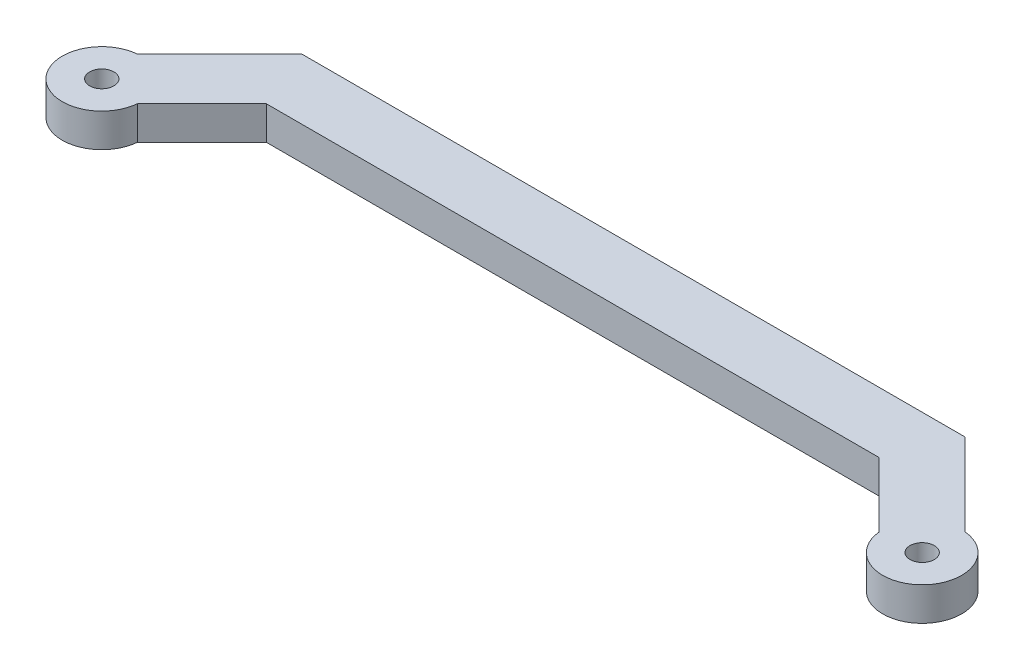
ISO-10303-21;
HEADER;
FILE_DESCRIPTION(('STEP AP214'),'2;1');
FILE_NAME('part.step','',(''),(''),'','','');
FILE_SCHEMA(('AUTOMOTIVE_DESIGN { 1 0 10303 214 1 1 1 1 }'));
ENDSEC;
DATA;
#1=APPLICATION_CONTEXT('core data for automotive mechanical design processes');
#2=APPLICATION_PROTOCOL_DEFINITION('international standard','automotive_design',2000,#1);
#3=PRODUCT_CONTEXT('',#1,'mechanical');
#4=PRODUCT('Part','Part','',(#3));
#5=PRODUCT_RELATED_PRODUCT_CATEGORY('part','',(#4));
#6=PRODUCT_DEFINITION_FORMATION('','',#4);
#7=PRODUCT_DEFINITION_CONTEXT('part definition',#1,'design');
#8=PRODUCT_DEFINITION('design','',#6,#7);
#9=PRODUCT_DEFINITION_SHAPE('','',#8);
#10=(LENGTH_UNIT() NAMED_UNIT(*) SI_UNIT(.MILLI.,.METRE.));
#11=(NAMED_UNIT(*) PLANE_ANGLE_UNIT() SI_UNIT($,.RADIAN.));
#12=(NAMED_UNIT(*) SI_UNIT($,.STERADIAN.) SOLID_ANGLE_UNIT());
#13=UNCERTAINTY_MEASURE_WITH_UNIT(LENGTH_MEASURE(1.E-05),#10,'distance_accuracy_value','');
#14=(GEOMETRIC_REPRESENTATION_CONTEXT(3) GLOBAL_UNCERTAINTY_ASSIGNED_CONTEXT((#13)) GLOBAL_UNIT_ASSIGNED_CONTEXT((#10,
#11,#12)) REPRESENTATION_CONTEXT('',''));
#15=CARTESIAN_POINT('',(0.,0.,0.));
#16=DIRECTION('',(0.,0.,1.));
#17=DIRECTION('',(1.,0.,0.));
#18=AXIS2_PLACEMENT_3D('',#15,#16,#17);
#19=CARTESIAN_POINT('',(-67.5,5.5,10.));
#20=DIRECTION('',(0.,-1.,0.));
#21=DIRECTION('',(0.,0.,-1.));
#22=AXIS2_PLACEMENT_3D('',#19,#20,#21);
#23=PLANE('',#22);
#24=CARTESIAN_POINT('',(-67.5,5.5,10.));
#25=DIRECTION('',(0.,-1.,0.));
#26=DIRECTION('',(0.,0.,-1.));
#27=AXIS2_PLACEMENT_3D('',#24,#25,#26);
#28=CIRCLE('',#27,2.);
#29=CARTESIAN_POINT('',(-67.5,5.5,8.00000000000001));
#30=VERTEX_POINT('',#29);
#31=EDGE_CURVE('E191',#30,#30,#28,.T.);
#32=ORIENTED_EDGE('',*,*,#31,.T.);
#33=EDGE_LOOP('',(#32));
#34=FACE_BOUND('',#33,.T.);
#35=DIRECTION('',(-0.707106781186546,0.,0.707106781186549));
#36=VECTOR('',#35,1.);
#37=CARTESIAN_POINT('',(-50.4289321881346,5.5,0.));
#38=LINE('',#37,#36);
#39=CARTESIAN_POINT('',(-50.4289321881346,5.5,0.));
#40=VERTEX_POINT('',#39);
#41=CARTESIAN_POINT('',(-61.0276310629496,5.5,10.598698874815));
#42=VERTEX_POINT('',#41);
#43=EDGE_CURVE('E205',#40,#42,#38,.T.);
#44=ORIENTED_EDGE('',*,*,#43,.F.);
#45=DIRECTION('',(1.,0.,0.));
#46=VECTOR('',#45,1.);
#47=CARTESIAN_POINT('',(-50.4289321881346,5.5,0.));
#48=LINE('',#47,#46);
#49=CARTESIAN_POINT('',(50.4289321881346,5.5,0.));
#50=VERTEX_POINT('',#49);
#51=EDGE_CURVE('E165',#40,#50,#48,.T.);
#52=ORIENTED_EDGE('',*,*,#51,.T.);
#53=DIRECTION('',(0.707106781186546,0.,0.707106781186549));
#54=VECTOR('',#53,1.);
#55=CARTESIAN_POINT('',(50.4289321881346,5.5,0.));
#56=LINE('',#55,#54);
#57=CARTESIAN_POINT('',(61.0276310629496,5.5,10.598698874815));
#58=VERTEX_POINT('',#57);
#59=EDGE_CURVE('E157',#50,#58,#56,.T.);
#60=ORIENTED_EDGE('',*,*,#59,.T.);
#61=CARTESIAN_POINT('',(67.5,5.5,9.99999999999999));
#62=DIRECTION('',(0.,1.,0.));
#63=DIRECTION('',(0.,0.,1.));
#64=AXIS2_PLACEMENT_3D('',#61,#62,#63);
#65=CIRCLE('',#64,6.5);
#66=CARTESIAN_POINT('',(68.0986988748151,5.5,3.52763106294956));
#67=VERTEX_POINT('',#66);
#68=EDGE_CURVE('E163',#58,#67,#65,.T.);
#69=ORIENTED_EDGE('',*,*,#68,.T.);
#70=DIRECTION('',(0.707106781186546,0.,0.707106781186549));
#71=VECTOR('',#70,1.);
#72=CARTESIAN_POINT('',(54.5710678118655,5.5,-10.));
#73=LINE('',#72,#71);
#74=CARTESIAN_POINT('',(54.5710678118655,5.5,-10.));
#75=VERTEX_POINT('',#74);
#76=EDGE_CURVE('E180',#75,#67,#73,.T.);
#77=ORIENTED_EDGE('',*,*,#76,.F.);
#78=DIRECTION('',(-1.,0.,0.));
#79=VECTOR('',#78,1.);
#80=CARTESIAN_POINT('',(54.5710678118655,5.5,-10.));
#81=LINE('',#80,#79);
#82=CARTESIAN_POINT('',(-54.5710678118655,5.5,-9.99999999999999));
#83=VERTEX_POINT('',#82);
#84=EDGE_CURVE('E182',#75,#83,#81,.T.);
#85=ORIENTED_EDGE('',*,*,#84,.T.);
#86=DIRECTION('',(-0.707106781186546,0.,0.707106781186549));
#87=VECTOR('',#86,1.);
#88=CARTESIAN_POINT('',(-54.5710678118655,5.5,-9.99999999999999));
#89=LINE('',#88,#87);
#90=CARTESIAN_POINT('',(-68.0986988748151,5.5,3.52763106294959));
#91=VERTEX_POINT('',#90);
#92=EDGE_CURVE('E227',#83,#91,#89,.T.);
#93=ORIENTED_EDGE('',*,*,#92,.T.);
#94=CARTESIAN_POINT('',(-67.5,5.5,10.));
#95=DIRECTION('',(0.,-1.,0.));
#96=DIRECTION('',(0.,0.,-1.));
#97=AXIS2_PLACEMENT_3D('',#94,#95,#96);
#98=CIRCLE('',#97,6.5);
#99=EDGE_CURVE('E232',#42,#91,#98,.T.);
#100=ORIENTED_EDGE('',*,*,#99,.F.);
#101=EDGE_LOOP('',(#44,#52,#60,#69,#77,#85,#93,#100));
#102=FACE_BOUND('',#101,.T.);
#103=CARTESIAN_POINT('',(67.5,5.5,9.99999999999999));
#104=DIRECTION('',(0.,1.,0.));
#105=DIRECTION('',(0.,0.,1.));
#106=AXIS2_PLACEMENT_3D('',#103,#104,#105);
#107=CIRCLE('',#106,2.);
#108=CARTESIAN_POINT('',(67.5,5.5,12.));
#109=VERTEX_POINT('',#108);
#110=EDGE_CURVE('E240',#109,#109,#107,.T.);
#111=ORIENTED_EDGE('',*,*,#110,.F.);
#112=EDGE_LOOP('',(#111));
#113=FACE_BOUND('',#112,.T.);
#114=ADVANCED_FACE('F87',(#34,#102,#113),#23,.F.);
#115=CARTESIAN_POINT('',(-67.5,0.,10.));
#116=DIRECTION('',(0.,-1.,0.));
#117=DIRECTION('',(0.,0.,-1.));
#118=AXIS2_PLACEMENT_3D('',#115,#116,#117);
#119=PLANE('',#118);
#120=DIRECTION('',(-0.707106781186546,0.,0.707106781186549));
#121=VECTOR('',#120,1.);
#122=CARTESIAN_POINT('',(-50.4289321881346,0.,0.));
#123=LINE('',#122,#121);
#124=CARTESIAN_POINT('',(-50.4289321881346,0.,0.));
#125=VERTEX_POINT('',#124);
#126=CARTESIAN_POINT('',(-61.0276310629496,0.,10.598698874815));
#127=VERTEX_POINT('',#126);
#128=EDGE_CURVE('E187',#125,#127,#123,.T.);
#129=ORIENTED_EDGE('',*,*,#128,.T.);
#130=CARTESIAN_POINT('',(-67.5,0.,10.));
#131=DIRECTION('',(0.,-1.,0.));
#132=DIRECTION('',(0.,0.,-1.));
#133=AXIS2_PLACEMENT_3D('',#130,#131,#132);
#134=CIRCLE('',#133,6.5);
#135=CARTESIAN_POINT('',(-68.0986988748151,0.,3.52763106294959));
#136=VERTEX_POINT('',#135);
#137=EDGE_CURVE('E190',#127,#136,#134,.T.);
#138=ORIENTED_EDGE('',*,*,#137,.T.);
#139=DIRECTION('',(-0.707106781186546,0.,0.707106781186549));
#140=VECTOR('',#139,1.);
#141=CARTESIAN_POINT('',(-54.5710678118655,0.,-9.99999999999999));
#142=LINE('',#141,#140);
#143=CARTESIAN_POINT('',(-54.5710678118655,0.,-9.99999999999999));
#144=VERTEX_POINT('',#143);
#145=EDGE_CURVE('E194',#144,#136,#142,.T.);
#146=ORIENTED_EDGE('',*,*,#145,.F.);
#147=DIRECTION('',(-1.,0.,0.));
#148=VECTOR('',#147,1.);
#149=CARTESIAN_POINT('',(54.5710678118655,0.,-10.));
#150=LINE('',#149,#148);
#151=CARTESIAN_POINT('',(54.5710678118655,0.,-10.));
#152=VERTEX_POINT('',#151);
#153=EDGE_CURVE('E197',#152,#144,#150,.T.);
#154=ORIENTED_EDGE('',*,*,#153,.F.);
#155=DIRECTION('',(0.707106781186546,0.,0.707106781186549));
#156=VECTOR('',#155,1.);
#157=CARTESIAN_POINT('',(54.5710678118655,0.,-10.));
#158=LINE('',#157,#156);
#159=CARTESIAN_POINT('',(68.0986988748151,0.,3.52763106294956));
#160=VERTEX_POINT('',#159);
#161=EDGE_CURVE('E199',#152,#160,#158,.T.);
#162=ORIENTED_EDGE('',*,*,#161,.T.);
#163=CARTESIAN_POINT('',(67.5,0.,9.99999999999999));
#164=DIRECTION('',(0.,1.,0.));
#165=DIRECTION('',(0.,0.,1.));
#166=AXIS2_PLACEMENT_3D('',#163,#164,#165);
#167=CIRCLE('',#166,6.5);
#168=CARTESIAN_POINT('',(61.0276310629496,0.,10.598698874815));
#169=VERTEX_POINT('',#168);
#170=EDGE_CURVE('E202',#169,#160,#167,.T.);
#171=ORIENTED_EDGE('',*,*,#170,.F.);
#172=DIRECTION('',(0.707106781186546,0.,0.707106781186549));
#173=VECTOR('',#172,1.);
#174=CARTESIAN_POINT('',(50.4289321881346,0.,0.));
#175=LINE('',#174,#173);
#176=CARTESIAN_POINT('',(50.4289321881346,0.,0.));
#177=VERTEX_POINT('',#176);
#178=EDGE_CURVE('E172',#177,#169,#175,.T.);
#179=ORIENTED_EDGE('',*,*,#178,.F.);
#180=DIRECTION('',(1.,0.,0.));
#181=VECTOR('',#180,1.);
#182=CARTESIAN_POINT('',(-50.4289321881346,0.,0.));
#183=LINE('',#182,#181);
#184=EDGE_CURVE('E133',#125,#177,#183,.T.);
#185=ORIENTED_EDGE('',*,*,#184,.F.);
#186=EDGE_LOOP('',(#129,#138,#146,#154,#162,#171,#179,#185));
#187=FACE_BOUND('',#186,.T.);
#188=CARTESIAN_POINT('',(-67.5,0.,10.));
#189=DIRECTION('',(0.,-1.,0.));
#190=DIRECTION('',(0.,0.,-1.));
#191=AXIS2_PLACEMENT_3D('',#188,#189,#190);
#192=CIRCLE('',#191,2.);
#193=CARTESIAN_POINT('',(-67.5,0.,8.00000000000001));
#194=VERTEX_POINT('',#193);
#195=EDGE_CURVE('E237',#194,#194,#192,.T.);
#196=ORIENTED_EDGE('',*,*,#195,.F.);
#197=EDGE_LOOP('',(#196));
#198=FACE_BOUND('',#197,.T.);
#199=CARTESIAN_POINT('',(67.5,0.,9.99999999999999));
#200=DIRECTION('',(0.,1.,0.));
#201=DIRECTION('',(0.,0.,1.));
#202=AXIS2_PLACEMENT_3D('',#199,#200,#201);
#203=CIRCLE('',#202,2.);
#204=CARTESIAN_POINT('',(67.5,0.,12.));
#205=VERTEX_POINT('',#204);
#206=EDGE_CURVE('E243',#205,#205,#203,.T.);
#207=ORIENTED_EDGE('',*,*,#206,.T.);
#208=EDGE_LOOP('',(#207));
#209=FACE_BOUND('',#208,.T.);
#210=ADVANCED_FACE('F218',(#187,#198,#209),#119,.T.);
#211=CARTESIAN_POINT('',(-50.4289321881346,5.5,0.));
#212=DIRECTION('',(0.707106781186549,0.,0.707106781186546));
#213=DIRECTION('',(0.707106781186546,0.,-0.707106781186549));
#214=AXIS2_PLACEMENT_3D('',#211,#212,#213);
#215=PLANE('',#214);
#216=ORIENTED_EDGE('',*,*,#128,.F.);
#217=DIRECTION('',(0.,-1.,0.));
#218=VECTOR('',#217,1.);
#219=CARTESIAN_POINT('',(-50.4289321881346,5.5,0.));
#220=LINE('',#219,#218);
#221=EDGE_CURVE('E12',#40,#125,#220,.T.);
#222=ORIENTED_EDGE('',*,*,#221,.F.);
#223=ORIENTED_EDGE('',*,*,#43,.T.);
#224=DIRECTION('',(0.,-1.,0.));
#225=VECTOR('',#224,1.);
#226=CARTESIAN_POINT('',(-61.0276310629496,5.5,10.598698874815));
#227=LINE('',#226,#225);
#228=EDGE_CURVE('E91',#42,#127,#227,.T.);
#229=ORIENTED_EDGE('',*,*,#228,.T.);
#230=EDGE_LOOP('',(#216,#222,#223,#229));
#231=FACE_BOUND('',#230,.T.);
#232=ADVANCED_FACE('F89',(#231),#215,.T.);
#233=CARTESIAN_POINT('',(-50.4289321881346,5.5,0.));
#234=DIRECTION('',(0.,0.,-1.));
#235=DIRECTION('',(-1.,0.,0.));
#236=AXIS2_PLACEMENT_3D('',#233,#234,#235);
#237=PLANE('',#236);
#238=ORIENTED_EDGE('',*,*,#184,.T.);
#239=DIRECTION('',(0.,-1.,0.));
#240=VECTOR('',#239,1.);
#241=CARTESIAN_POINT('',(50.4289321881346,5.5,0.));
#242=LINE('',#241,#240);
#243=EDGE_CURVE('E97',#50,#177,#242,.T.);
#244=ORIENTED_EDGE('',*,*,#243,.F.);
#245=ORIENTED_EDGE('',*,*,#51,.F.);
#246=ORIENTED_EDGE('',*,*,#221,.T.);
#247=EDGE_LOOP('',(#238,#244,#245,#246));
#248=FACE_BOUND('',#247,.T.);
#249=ADVANCED_FACE('F262',(#248),#237,.F.);
#250=CARTESIAN_POINT('',(50.4289321881346,5.5,0.));
#251=DIRECTION('',(0.707106781186549,0.,-0.707106781186546));
#252=DIRECTION('',(-0.707106781186546,0.,-0.707106781186549));
#253=AXIS2_PLACEMENT_3D('',#250,#251,#252);
#254=PLANE('',#253);
#255=ORIENTED_EDGE('',*,*,#178,.T.);
#256=DIRECTION('',(0.,-1.,0.));
#257=VECTOR('',#256,1.);
#258=CARTESIAN_POINT('',(61.0276310629496,5.5,10.598698874815));
#259=LINE('',#258,#257);
#260=EDGE_CURVE('E169',#58,#169,#259,.T.);
#261=ORIENTED_EDGE('',*,*,#260,.F.);
#262=ORIENTED_EDGE('',*,*,#59,.F.);
#263=ORIENTED_EDGE('',*,*,#243,.T.);
#264=EDGE_LOOP('',(#255,#261,#262,#263));
#265=FACE_BOUND('',#264,.T.);
#266=ADVANCED_FACE('F170',(#265),#254,.F.);
#267=CARTESIAN_POINT('',(67.5,5.5,9.99999999999999));
#268=DIRECTION('',(0.,-1.,0.));
#269=DIRECTION('',(0.,0.,-1.));
#270=AXIS2_PLACEMENT_3D('',#267,#268,#269);
#271=CYLINDRICAL_SURFACE('',#270,6.5);
#272=ORIENTED_EDGE('',*,*,#170,.T.);
#273=DIRECTION('',(0.,-1.,0.));
#274=VECTOR('',#273,1.);
#275=CARTESIAN_POINT('',(68.0986988748151,5.5,3.52763106294956));
#276=LINE('',#275,#274);
#277=EDGE_CURVE('E176',#67,#160,#276,.T.);
#278=ORIENTED_EDGE('',*,*,#277,.F.);
#279=ORIENTED_EDGE('',*,*,#68,.F.);
#280=ORIENTED_EDGE('',*,*,#260,.T.);
#281=EDGE_LOOP('',(#272,#278,#279,#280));
#282=FACE_BOUND('',#281,.T.);
#283=ADVANCED_FACE('F178',(#282),#271,.T.);
#284=CARTESIAN_POINT('',(54.5710678118655,5.5,-10.));
#285=DIRECTION('',(0.707106781186549,0.,-0.707106781186546));
#286=DIRECTION('',(-0.707106781186546,0.,-0.707106781186549));
#287=AXIS2_PLACEMENT_3D('',#284,#285,#286);
#288=PLANE('',#287);
#289=ORIENTED_EDGE('',*,*,#161,.F.);
#290=DIRECTION('',(0.,-1.,0.));
#291=VECTOR('',#290,1.);
#292=CARTESIAN_POINT('',(54.5710678118655,5.5,-10.));
#293=LINE('',#292,#291);
#294=EDGE_CURVE('E209',#75,#152,#293,.T.);
#295=ORIENTED_EDGE('',*,*,#294,.F.);
#296=ORIENTED_EDGE('',*,*,#76,.T.);
#297=ORIENTED_EDGE('',*,*,#277,.T.);
#298=EDGE_LOOP('',(#289,#295,#296,#297));
#299=FACE_BOUND('',#298,.T.);
#300=ADVANCED_FACE('F223',(#299),#288,.T.);
#301=CARTESIAN_POINT('',(54.5710678118655,5.5,-10.));
#302=DIRECTION('',(0.,0.,1.));
#303=DIRECTION('',(1.,0.,0.));
#304=AXIS2_PLACEMENT_3D('',#301,#302,#303);
#305=PLANE('',#304);
#306=ORIENTED_EDGE('',*,*,#153,.T.);
#307=DIRECTION('',(0.,-1.,0.));
#308=VECTOR('',#307,1.);
#309=CARTESIAN_POINT('',(-54.5710678118655,5.5,-9.99999999999999));
#310=LINE('',#309,#308);
#311=EDGE_CURVE('E211',#83,#144,#310,.T.);
#312=ORIENTED_EDGE('',*,*,#311,.F.);
#313=ORIENTED_EDGE('',*,*,#84,.F.);
#314=ORIENTED_EDGE('',*,*,#294,.T.);
#315=EDGE_LOOP('',(#306,#312,#313,#314));
#316=FACE_BOUND('',#315,.T.);
#317=ADVANCED_FACE('F229',(#316),#305,.F.);
#318=CARTESIAN_POINT('',(-54.5710678118655,5.5,-9.99999999999999));
#319=DIRECTION('',(0.707106781186549,0.,0.707106781186546));
#320=DIRECTION('',(0.707106781186546,0.,-0.707106781186549));
#321=AXIS2_PLACEMENT_3D('',#318,#319,#320);
#322=PLANE('',#321);
#323=ORIENTED_EDGE('',*,*,#145,.T.);
#324=DIRECTION('',(0.,-1.,0.));
#325=VECTOR('',#324,1.);
#326=CARTESIAN_POINT('',(-68.0986988748151,5.5,3.52763106294959));
#327=LINE('',#326,#325);
#328=EDGE_CURVE('E213',#91,#136,#327,.T.);
#329=ORIENTED_EDGE('',*,*,#328,.F.);
#330=ORIENTED_EDGE('',*,*,#92,.F.);
#331=ORIENTED_EDGE('',*,*,#311,.T.);
#332=EDGE_LOOP('',(#323,#329,#330,#331));
#333=FACE_BOUND('',#332,.T.);
#334=ADVANCED_FACE('F231',(#333),#322,.F.);
#335=CARTESIAN_POINT('',(-67.5,5.5,10.));
#336=DIRECTION('',(0.,-1.,0.));
#337=DIRECTION('',(0.,0.,-1.));
#338=AXIS2_PLACEMENT_3D('',#335,#336,#337);
#339=CYLINDRICAL_SURFACE('',#338,6.5);
#340=ORIENTED_EDGE('',*,*,#137,.F.);
#341=ORIENTED_EDGE('',*,*,#228,.F.);
#342=ORIENTED_EDGE('',*,*,#99,.T.);
#343=ORIENTED_EDGE('',*,*,#328,.T.);
#344=EDGE_LOOP('',(#340,#341,#342,#343));
#345=FACE_BOUND('',#344,.T.);
#346=ADVANCED_FACE('F215',(#345),#339,.T.);
#347=CARTESIAN_POINT('',(-67.5,5.5,10.));
#348=DIRECTION('',(0.,-1.,0.));
#349=DIRECTION('',(0.,0.,-1.));
#350=AXIS2_PLACEMENT_3D('',#347,#348,#349);
#351=CYLINDRICAL_SURFACE('',#350,2.);
#352=ORIENTED_EDGE('',*,*,#31,.F.);
#353=EDGE_LOOP('',(#352));
#354=FACE_BOUND('',#353,.T.);
#355=ORIENTED_EDGE('',*,*,#195,.T.);
#356=EDGE_LOOP('',(#355));
#357=FACE_BOUND('',#356,.T.);
#358=ADVANCED_FACE('F259',(#354,#357),#351,.F.);
#359=CARTESIAN_POINT('',(67.5,5.5,9.99999999999999));
#360=DIRECTION('',(0.,-1.,0.));
#361=DIRECTION('',(0.,0.,-1.));
#362=AXIS2_PLACEMENT_3D('',#359,#360,#361);
#363=CYLINDRICAL_SURFACE('',#362,2.);
#364=ORIENTED_EDGE('',*,*,#110,.T.);
#365=EDGE_LOOP('',(#364));
#366=FACE_BOUND('',#365,.T.);
#367=ORIENTED_EDGE('',*,*,#206,.F.);
#368=EDGE_LOOP('',(#367));
#369=FACE_BOUND('',#368,.T.);
#370=ADVANCED_FACE('F249',(#366,#369),#363,.F.);
#371=CLOSED_SHELL('',(#114,#210,#232,#249,#266,#283,#300,#317,#334,#346,#358,#370));
#372=MANIFOLD_SOLID_BREP('B2',#371);
#373=ADVANCED_BREP_SHAPE_REPRESENTATION('',(#18,#372),#14);
#374=SHAPE_DEFINITION_REPRESENTATION(#9,#373);
ENDSEC;
END-ISO-10303-21;
